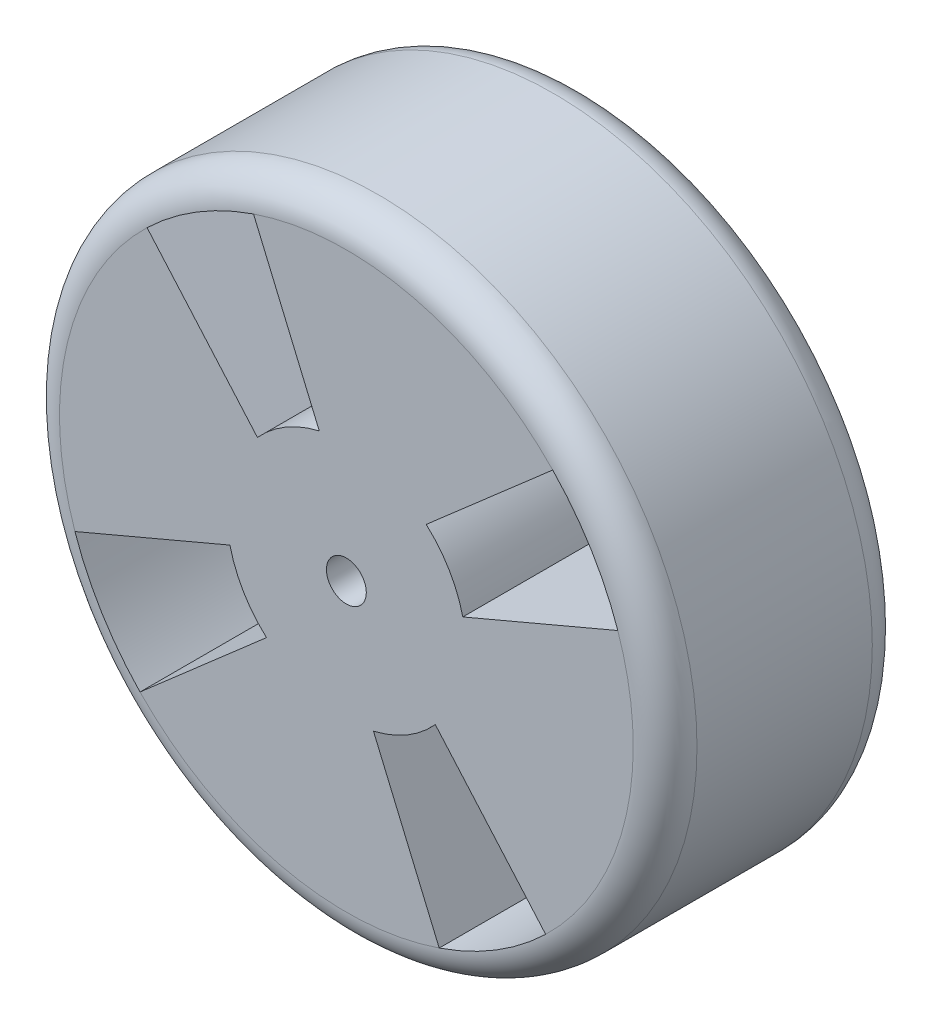
ISO-10303-21;
HEADER;
FILE_DESCRIPTION(('STEP AP214'),'2;1');
FILE_NAME('part.step','',(''),(''),'','','');
FILE_SCHEMA(('AUTOMOTIVE_DESIGN { 1 0 10303 214 1 1 1 1 }'));
ENDSEC;
DATA;
#1=APPLICATION_CONTEXT('core data for automotive mechanical design processes');
#2=APPLICATION_PROTOCOL_DEFINITION('international standard','automotive_design',2000,#1);
#3=PRODUCT_CONTEXT('',#1,'mechanical');
#4=PRODUCT('Part','Part','',(#3));
#5=PRODUCT_RELATED_PRODUCT_CATEGORY('part','',(#4));
#6=PRODUCT_DEFINITION_FORMATION('','',#4);
#7=PRODUCT_DEFINITION_CONTEXT('part definition',#1,'design');
#8=PRODUCT_DEFINITION('design','',#6,#7);
#9=PRODUCT_DEFINITION_SHAPE('','',#8);
#10=(LENGTH_UNIT() NAMED_UNIT(*) SI_UNIT(.MILLI.,.METRE.));
#11=(NAMED_UNIT(*) PLANE_ANGLE_UNIT() SI_UNIT($,.RADIAN.));
#12=(NAMED_UNIT(*) SI_UNIT($,.STERADIAN.) SOLID_ANGLE_UNIT());
#13=UNCERTAINTY_MEASURE_WITH_UNIT(LENGTH_MEASURE(1.E-05),#10,'distance_accuracy_value','');
#14=(GEOMETRIC_REPRESENTATION_CONTEXT(3) GLOBAL_UNCERTAINTY_ASSIGNED_CONTEXT((#13)) GLOBAL_UNIT_ASSIGNED_CONTEXT((#10,
#11,#12)) REPRESENTATION_CONTEXT('',''));
#15=CARTESIAN_POINT('',(0.,0.,0.));
#16=DIRECTION('',(0.,0.,1.));
#17=DIRECTION('',(1.,0.,0.));
#18=AXIS2_PLACEMENT_3D('',#15,#16,#17);
#19=CARTESIAN_POINT('',(0.,0.,-76.2));
#20=DIRECTION('',(0.,0.,1.));
#21=DIRECTION('',(1.,0.,0.));
#22=AXIS2_PLACEMENT_3D('',#19,#20,#21);
#23=PLANE('',#22);
#24=CARTESIAN_POINT('',(0.,0.,-76.2));
#25=DIRECTION('',(0.,0.,1.));
#26=DIRECTION('',(1.,0.,0.));
#27=AXIS2_PLACEMENT_3D('',#24,#25,#26);
#28=CIRCLE('',#27,6.35);
#29=CARTESIAN_POINT('',(6.35,0.,-76.2));
#30=VERTEX_POINT('',#29);
#31=EDGE_CURVE('E219',#30,#30,#28,.F.);
#32=ORIENTED_EDGE('',*,*,#31,.F.);
#33=EDGE_LOOP('',(#32));
#34=FACE_BOUND('',#33,.T.);
#35=DIRECTION('',(-0.390462395273244,0.92061887764562,0.));
#36=VECTOR('',#35,1.);
#37=CARTESIAN_POINT('',(-29.5936715184726,86.5187159293101,-76.2));
#38=LINE('',#37,#36);
#39=CARTESIAN_POINT('',(-8.63712455840803,37.108086441671,-76.2));
#40=VERTEX_POINT('',#39);
#41=CARTESIAN_POINT('',(-29.5936715184726,86.5187159293101,-76.2));
#42=VERTEX_POINT('',#41);
#43=EDGE_CURVE('E272',#40,#42,#38,.T.);
#44=ORIENTED_EDGE('',*,*,#43,.T.);
#45=CARTESIAN_POINT('',(0.,0.,-76.2));
#46=DIRECTION('',(0.,0.,1.));
#47=DIRECTION('',(1.,0.,0.));
#48=AXIS2_PLACEMENT_3D('',#45,#46,#47);
#49=CIRCLE('',#48,91.44);
#50=CARTESIAN_POINT('',(65.773312703652,63.5227906816728,-76.2));
#51=VERTEX_POINT('',#50);
#52=EDGE_CURVE('E202',#42,#51,#49,.F.);
#53=ORIENTED_EDGE('',*,*,#52,.T.);
#54=DIRECTION('',(0.753572898777188,0.657364348157509,0.));
#55=VECTOR('',#54,1.);
#56=CARTESIAN_POINT('',(65.7733127036517,63.5227906816725,-76.2));
#57=LINE('',#56,#55);
#58=CARTESIAN_POINT('',(25.4532274537559,28.3503652919561,-76.2));
#59=VERTEX_POINT('',#58);
#60=EDGE_CURVE('E58',#59,#51,#57,.T.);
#61=ORIENTED_EDGE('',*,*,#60,.F.);
#62=CARTESIAN_POINT('',(9.00235652214454E-13,3.496822267853E-12,-76.2));
#63=DIRECTION('',(0.,0.,1.));
#64=DIRECTION('',(1.,0.,0.));
#65=AXIS2_PLACEMENT_3D('',#62,#63,#64);
#66=CIRCLE('',#65,38.0999999999966);
#67=CARTESIAN_POINT('',(37.1080864416684,8.63712455841242,-76.2));
#68=VERTEX_POINT('',#67);
#69=EDGE_CURVE('E227',#68,#59,#66,.T.);
#70=ORIENTED_EDGE('',*,*,#69,.F.);
#71=DIRECTION('',(0.92061887764562,0.390462395273245,0.));
#72=VECTOR('',#71,1.);
#73=CARTESIAN_POINT('',(86.5187159293075,29.593671518477,-76.2));
#74=LINE('',#73,#72);
#75=CARTESIAN_POINT('',(86.5187159293075,29.593671518477,-76.2));
#76=VERTEX_POINT('',#75);
#77=EDGE_CURVE('E258',#68,#76,#74,.T.);
#78=ORIENTED_EDGE('',*,*,#77,.T.);
#79=CARTESIAN_POINT('',(63.5227906816734,-65.7733127036513,-76.2));
#80=VERTEX_POINT('',#79);
#81=EDGE_CURVE('E207',#76,#80,#49,.F.);
#82=ORIENTED_EDGE('',*,*,#81,.T.);
#83=DIRECTION('',(0.657364348157509,-0.753572898777188,0.));
#84=VECTOR('',#83,1.);
#85=CARTESIAN_POINT('',(63.5227906816699,-65.7733127036473,-76.2));
#86=LINE('',#85,#84);
#87=CARTESIAN_POINT('',(28.3503652919535,-25.4532274537515,-76.2));
#88=VERTEX_POINT('',#87);
#89=EDGE_CURVE('E267',#88,#80,#86,.T.);
#90=ORIENTED_EDGE('',*,*,#89,.F.);
#91=CARTESIAN_POINT('',(9.00235652214454E-13,3.496822267853E-12,-76.2));
#92=DIRECTION('',(0.,0.,1.));
#93=DIRECTION('',(1.,0.,0.));
#94=AXIS2_PLACEMENT_3D('',#91,#92,#93);
#95=CIRCLE('',#94,38.0999999999966);
#96=CARTESIAN_POINT('',(8.63712455840983,-37.108086441664,-76.2));
#97=VERTEX_POINT('',#96);
#98=EDGE_CURVE('E306',#97,#88,#95,.T.);
#99=ORIENTED_EDGE('',*,*,#98,.F.);
#100=DIRECTION('',(0.390462395273245,-0.92061887764562,0.));
#101=VECTOR('',#100,1.);
#102=CARTESIAN_POINT('',(29.5936715184744,-86.5187159293031,-76.2));
#103=LINE('',#102,#101);
#104=CARTESIAN_POINT('',(29.5936715184744,-86.5187159293031,-76.2));
#105=VERTEX_POINT('',#104);
#106=EDGE_CURVE('E310',#97,#105,#103,.T.);
#107=ORIENTED_EDGE('',*,*,#106,.T.);
#108=CARTESIAN_POINT('',(-65.7733127036548,-63.5227906816698,-76.2));
#109=VERTEX_POINT('',#108);
#110=EDGE_CURVE('E201',#105,#109,#49,.F.);
#111=ORIENTED_EDGE('',*,*,#110,.T.);
#112=DIRECTION('',(-0.753572898777188,-0.657364348157509,0.));
#113=VECTOR('',#112,1.);
#114=CARTESIAN_POINT('',(-65.7733127036499,-63.5227906816655,-76.2));
#115=LINE('',#114,#113);
#116=CARTESIAN_POINT('',(-25.4532274537541,-28.3503652919491,-76.2));
#117=VERTEX_POINT('',#116);
#118=EDGE_CURVE('E169',#117,#109,#115,.T.);
#119=ORIENTED_EDGE('',*,*,#118,.F.);
#120=CARTESIAN_POINT('',(9.00235652214454E-13,3.496822267853E-12,-76.2));
#121=DIRECTION('',(0.,0.,1.));
#122=DIRECTION('',(1.,0.,0.));
#123=AXIS2_PLACEMENT_3D('',#120,#121,#122);
#124=CIRCLE('',#123,38.0999999999966);
#125=CARTESIAN_POINT('',(-37.1080864416666,-8.63712455840543,-76.2));
#126=VERTEX_POINT('',#125);
#127=EDGE_CURVE('E182',#126,#117,#124,.T.);
#128=ORIENTED_EDGE('',*,*,#127,.F.);
#129=DIRECTION('',(-0.92061887764562,-0.390462395273245,0.));
#130=VECTOR('',#129,1.);
#131=CARTESIAN_POINT('',(-86.5187159293057,-29.59367151847,-76.2));
#132=LINE('',#131,#130);
#133=CARTESIAN_POINT('',(-86.5187159293057,-29.59367151847,-76.2));
#134=VERTEX_POINT('',#133);
#135=EDGE_CURVE('E160',#126,#134,#132,.T.);
#136=ORIENTED_EDGE('',*,*,#135,.T.);
#137=CARTESIAN_POINT('',(-63.5227906816692,65.7733127036555,-76.2));
#138=VERTEX_POINT('',#137);
#139=EDGE_CURVE('E187',#134,#138,#49,.F.);
#140=ORIENTED_EDGE('',*,*,#139,.T.);
#141=DIRECTION('',(-0.657364348157509,0.753572898777187,0.));
#142=VECTOR('',#141,1.);
#143=CARTESIAN_POINT('',(-63.5227906816681,65.7733127036543,-76.2));
#144=LINE('',#143,#142);
#145=CARTESIAN_POINT('',(-28.3503652919517,25.4532274537585,-76.2));
#146=VERTEX_POINT('',#145);
#147=EDGE_CURVE('E66',#146,#138,#144,.T.);
#148=ORIENTED_EDGE('',*,*,#147,.F.);
#149=CARTESIAN_POINT('',(9.00235652214454E-13,3.496822267853E-12,-76.2));
#150=DIRECTION('',(0.,0.,1.));
#151=DIRECTION('',(1.,0.,0.));
#152=AXIS2_PLACEMENT_3D('',#149,#150,#151);
#153=CIRCLE('',#152,38.0999999999966);
#154=EDGE_CURVE('E268',#40,#146,#153,.T.);
#155=ORIENTED_EDGE('',*,*,#154,.F.);
#156=EDGE_LOOP('',(#44,#53,#61,#70,#78,#82,#90,#99,#107,#111,#119,#128,#136,#140,#148,#155));
#157=FACE_BOUND('',#156,.T.);
#158=ADVANCED_FACE('F41',(#34,#157),#23,.F.);
#159=CARTESIAN_POINT('',(0.,0.,0.));
#160=DIRECTION('',(0.,0.,1.));
#161=DIRECTION('',(1.,0.,0.));
#162=AXIS2_PLACEMENT_3D('',#159,#160,#161);
#163=PLANE('',#162);
#164=CARTESIAN_POINT('',(0.,0.,0.));
#165=DIRECTION('',(0.,0.,1.));
#166=DIRECTION('',(1.,0.,0.));
#167=AXIS2_PLACEMENT_3D('',#164,#165,#166);
#168=CIRCLE('',#167,6.35);
#169=CARTESIAN_POINT('',(6.35,0.,0.));
#170=VERTEX_POINT('',#169);
#171=EDGE_CURVE('E223',#170,#170,#168,.T.);
#172=ORIENTED_EDGE('',*,*,#171,.F.);
#173=EDGE_LOOP('',(#172));
#174=FACE_BOUND('',#173,.T.);
#175=CARTESIAN_POINT('',(0.,0.,0.));
#176=DIRECTION('',(0.,0.,1.));
#177=DIRECTION('',(1.,0.,0.));
#178=AXIS2_PLACEMENT_3D('',#175,#176,#177);
#179=CIRCLE('',#178,91.44);
#180=CARTESIAN_POINT('',(65.7733127036517,63.5227906816725,0.));
#181=VERTEX_POINT('',#180);
#182=CARTESIAN_POINT('',(-29.5936715184727,86.5187159293106,0.));
#183=VERTEX_POINT('',#182);
#184=EDGE_CURVE('E50',#181,#183,#179,.T.);
#185=ORIENTED_EDGE('',*,*,#184,.T.);
#186=DIRECTION('',(0.390462395273244,-0.92061887764562,0.));
#187=VECTOR('',#186,1.);
#188=CARTESIAN_POINT('',(-29.5936715184726,86.5187159293101,0.));
#189=LINE('',#188,#187);
#190=CARTESIAN_POINT('',(-8.63712455840803,37.108086441671,0.));
#191=VERTEX_POINT('',#190);
#192=EDGE_CURVE('E279',#183,#191,#189,.T.);
#193=ORIENTED_EDGE('',*,*,#192,.T.);
#194=CARTESIAN_POINT('',(9.00235652214454E-13,3.496822267853E-12,0.));
#195=DIRECTION('',(0.,0.,-1.));
#196=DIRECTION('',(-1.,0.,0.));
#197=AXIS2_PLACEMENT_3D('',#194,#195,#196);
#198=CIRCLE('',#197,38.0999999999966);
#199=CARTESIAN_POINT('',(-28.3503652919517,25.4532274537585,0.));
#200=VERTEX_POINT('',#199);
#201=EDGE_CURVE('E283',#200,#191,#198,.T.);
#202=ORIENTED_EDGE('',*,*,#201,.F.);
#203=DIRECTION('',(0.657364348157509,-0.753572898777188,0.));
#204=VECTOR('',#203,1.);
#205=CARTESIAN_POINT('',(-63.5227906816681,65.7733127036543,0.));
#206=LINE('',#205,#204);
#207=CARTESIAN_POINT('',(-63.5227906816681,65.7733127036543,0.));
#208=VERTEX_POINT('',#207);
#209=EDGE_CURVE('E287',#208,#200,#206,.T.);
#210=ORIENTED_EDGE('',*,*,#209,.F.);
#211=CARTESIAN_POINT('',(-86.5187159293109,-29.5936715184718,0.));
#212=VERTEX_POINT('',#211);
#213=EDGE_CURVE('E456',#208,#212,#179,.T.);
#214=ORIENTED_EDGE('',*,*,#213,.T.);
#215=DIRECTION('',(0.92061887764562,0.390462395273245,0.));
#216=VECTOR('',#215,1.);
#217=CARTESIAN_POINT('',(-86.5187159293057,-29.59367151847,0.));
#218=LINE('',#217,#216);
#219=CARTESIAN_POINT('',(-37.1080864416666,-8.63712455840543,0.));
#220=VERTEX_POINT('',#219);
#221=EDGE_CURVE('E163',#212,#220,#218,.T.);
#222=ORIENTED_EDGE('',*,*,#221,.T.);
#223=CARTESIAN_POINT('',(9.00235652214454E-13,3.496822267853E-12,0.));
#224=DIRECTION('',(0.,0.,-1.));
#225=DIRECTION('',(-1.,0.,0.));
#226=AXIS2_PLACEMENT_3D('',#223,#224,#225);
#227=CIRCLE('',#226,38.0999999999966);
#228=CARTESIAN_POINT('',(-25.4532274537541,-28.3503652919491,0.));
#229=VERTEX_POINT('',#228);
#230=EDGE_CURVE('E351',#229,#220,#227,.T.);
#231=ORIENTED_EDGE('',*,*,#230,.F.);
#232=DIRECTION('',(0.753572898777188,0.657364348157509,0.));
#233=VECTOR('',#232,1.);
#234=CARTESIAN_POINT('',(-65.7733127036499,-63.5227906816655,0.));
#235=LINE('',#234,#233);
#236=CARTESIAN_POINT('',(-65.7733127036499,-63.5227906816655,0.));
#237=VERTEX_POINT('',#236);
#238=EDGE_CURVE('E355',#237,#229,#235,.T.);
#239=ORIENTED_EDGE('',*,*,#238,.F.);
#240=CARTESIAN_POINT('',(29.5936715184765,-86.5187159293093,0.));
#241=VERTEX_POINT('',#240);
#242=EDGE_CURVE('E453',#237,#241,#179,.T.);
#243=ORIENTED_EDGE('',*,*,#242,.T.);
#244=DIRECTION('',(-0.390462395273245,0.92061887764562,0.));
#245=VECTOR('',#244,1.);
#246=CARTESIAN_POINT('',(29.5936715184744,-86.5187159293031,0.));
#247=LINE('',#246,#245);
#248=CARTESIAN_POINT('',(8.63712455840983,-37.108086441664,0.));
#249=VERTEX_POINT('',#248);
#250=EDGE_CURVE('E318',#241,#249,#247,.T.);
#251=ORIENTED_EDGE('',*,*,#250,.T.);
#252=CARTESIAN_POINT('',(9.00235652214454E-13,3.496822267853E-12,0.));
#253=DIRECTION('',(0.,0.,-1.));
#254=DIRECTION('',(-1.,0.,0.));
#255=AXIS2_PLACEMENT_3D('',#252,#253,#254);
#256=CIRCLE('',#255,38.0999999999966);
#257=CARTESIAN_POINT('',(28.3503652919535,-25.4532274537515,0.));
#258=VERTEX_POINT('',#257);
#259=EDGE_CURVE('E322',#258,#249,#256,.T.);
#260=ORIENTED_EDGE('',*,*,#259,.F.);
#261=DIRECTION('',(-0.657364348157509,0.753572898777188,0.));
#262=VECTOR('',#261,1.);
#263=CARTESIAN_POINT('',(63.5227906816699,-65.7733127036473,0.));
#264=LINE('',#263,#262);
#265=CARTESIAN_POINT('',(63.5227906816699,-65.7733127036473,0.));
#266=VERTEX_POINT('',#265);
#267=EDGE_CURVE('E326',#266,#258,#264,.T.);
#268=ORIENTED_EDGE('',*,*,#267,.F.);
#269=CARTESIAN_POINT('',(86.5187159293089,29.5936715184776,0.));
#270=VERTEX_POINT('',#269);
#271=EDGE_CURVE('E51',#266,#270,#179,.T.);
#272=ORIENTED_EDGE('',*,*,#271,.T.);
#273=DIRECTION('',(-0.92061887764562,-0.390462395273245,0.));
#274=VECTOR('',#273,1.);
#275=CARTESIAN_POINT('',(86.5187159293075,29.593671518477,0.));
#276=LINE('',#275,#274);
#277=CARTESIAN_POINT('',(37.1080864416684,8.63712455841242,0.));
#278=VERTEX_POINT('',#277);
#279=EDGE_CURVE('E236',#270,#278,#276,.T.);
#280=ORIENTED_EDGE('',*,*,#279,.T.);
#281=CARTESIAN_POINT('',(9.00235652214454E-13,3.496822267853E-12,0.));
#282=DIRECTION('',(0.,0.,-1.));
#283=DIRECTION('',(-1.,0.,0.));
#284=AXIS2_PLACEMENT_3D('',#281,#282,#283);
#285=CIRCLE('',#284,38.0999999999966);
#286=CARTESIAN_POINT('',(25.4532274537559,28.3503652919561,0.));
#287=VERTEX_POINT('',#286);
#288=EDGE_CURVE('E248',#287,#278,#285,.T.);
#289=ORIENTED_EDGE('',*,*,#288,.F.);
#290=DIRECTION('',(-0.753572898777188,-0.657364348157509,0.));
#291=VECTOR('',#290,1.);
#292=CARTESIAN_POINT('',(65.7733127036517,63.5227906816725,0.));
#293=LINE('',#292,#291);
#294=EDGE_CURVE('E252',#181,#287,#293,.T.);
#295=ORIENTED_EDGE('',*,*,#294,.F.);
#296=EDGE_LOOP('',(#185,#193,#202,#210,#214,#222,#231,#239,#243,#251,#260,#268,#272,#280,#289,#295));
#297=FACE_BOUND('',#296,.T.);
#298=ADVANCED_FACE('F403',(#174,#297),#163,.T.);
#299=CARTESIAN_POINT('',(0.,0.,-76.2));
#300=DIRECTION('',(0.,0.,1.));
#301=DIRECTION('',(1.,0.,0.));
#302=AXIS2_PLACEMENT_3D('',#299,#300,#301);
#303=CYLINDRICAL_SURFACE('',#302,101.6);
#304=CARTESIAN_POINT('',(0.,0.,-66.04));
#305=DIRECTION('',(0.,0.,1.));
#306=DIRECTION('',(1.,0.,0.));
#307=AXIS2_PLACEMENT_3D('',#304,#305,#306);
#308=CIRCLE('',#307,101.6);
#309=CARTESIAN_POINT('',(101.6,0.,-66.04));
#310=VERTEX_POINT('',#309);
#311=EDGE_CURVE('E211',#310,#310,#308,.T.);
#312=CARTESIAN_POINT('',(0.,0.,-10.16));
#313=DIRECTION('',(0.,0.,1.));
#314=DIRECTION('',(1.,0.,0.));
#315=AXIS2_PLACEMENT_3D('',#312,#313,#314);
#316=CIRCLE('',#315,101.6);
#317=CARTESIAN_POINT('',(101.6,0.,-10.16));
#318=VERTEX_POINT('',#317);
#319=EDGE_CURVE('E215',#318,#318,#316,.F.);
#320=CARTESIAN_POINT('',(101.6,0.,-66.04));
#321=CARTESIAN_POINT('',(101.6,0.,-65.4579166666667));
#322=CARTESIAN_POINT('',(101.6,0.,-64.8758333333333));
#323=CARTESIAN_POINT('',(101.6,0.,-63.7116666666667));
#324=CARTESIAN_POINT('',(101.6,0.,-63.1295833333333));
#325=CARTESIAN_POINT('',(101.6,0.,-61.9654166666667));
#326=CARTESIAN_POINT('',(101.6,0.,-61.3833333333333));
#327=CARTESIAN_POINT('',(101.6,0.,-60.2191666666667));
#328=CARTESIAN_POINT('',(101.6,0.,-59.6370833333333));
#329=CARTESIAN_POINT('',(101.6,0.,-58.4729166666667));
#330=CARTESIAN_POINT('',(101.6,0.,-57.8908333333333));
#331=CARTESIAN_POINT('',(101.6,0.,-56.7266666666667));
#332=CARTESIAN_POINT('',(101.6,0.,-56.1445833333333));
#333=CARTESIAN_POINT('',(101.6,0.,-54.9804166666667));
#334=CARTESIAN_POINT('',(101.6,0.,-54.3983333333333));
#335=CARTESIAN_POINT('',(101.6,0.,-53.2341666666667));
#336=CARTESIAN_POINT('',(101.6,0.,-52.6520833333333));
#337=CARTESIAN_POINT('',(101.6,0.,-51.4879166666667));
#338=CARTESIAN_POINT('',(101.6,0.,-50.9058333333333));
#339=CARTESIAN_POINT('',(101.6,0.,-49.7416666666667));
#340=CARTESIAN_POINT('',(101.6,0.,-49.1595833333333));
#341=CARTESIAN_POINT('',(101.6,0.,-47.9954166666667));
#342=CARTESIAN_POINT('',(101.6,0.,-47.4133333333333));
#343=CARTESIAN_POINT('',(101.6,0.,-46.2491666666667));
#344=CARTESIAN_POINT('',(101.6,0.,-45.6670833333333));
#345=CARTESIAN_POINT('',(101.6,0.,-44.5029166666667));
#346=CARTESIAN_POINT('',(101.6,0.,-43.9208333333333));
#347=CARTESIAN_POINT('',(101.6,0.,-42.7566666666667));
#348=CARTESIAN_POINT('',(101.6,0.,-42.1745833333333));
#349=CARTESIAN_POINT('',(101.6,0.,-41.0104166666667));
#350=CARTESIAN_POINT('',(101.6,0.,-40.4283333333333));
#351=CARTESIAN_POINT('',(101.6,0.,-39.2641666666667));
#352=CARTESIAN_POINT('',(101.6,0.,-38.6820833333333));
#353=CARTESIAN_POINT('',(101.6,0.,-37.5179166666667));
#354=CARTESIAN_POINT('',(101.6,0.,-36.9358333333333));
#355=CARTESIAN_POINT('',(101.6,0.,-35.7716666666667));
#356=CARTESIAN_POINT('',(101.6,0.,-35.1895833333333));
#357=CARTESIAN_POINT('',(101.6,0.,-34.0254166666667));
#358=CARTESIAN_POINT('',(101.6,0.,-33.4433333333333));
#359=CARTESIAN_POINT('',(101.6,0.,-32.2791666666667));
#360=CARTESIAN_POINT('',(101.6,0.,-31.6970833333333));
#361=CARTESIAN_POINT('',(101.6,0.,-30.5329166666667));
#362=CARTESIAN_POINT('',(101.6,0.,-29.9508333333333));
#363=CARTESIAN_POINT('',(101.6,0.,-28.7866666666667));
#364=CARTESIAN_POINT('',(101.6,0.,-28.2045833333333));
#365=CARTESIAN_POINT('',(101.6,0.,-27.0404166666667));
#366=CARTESIAN_POINT('',(101.6,0.,-26.4583333333333));
#367=CARTESIAN_POINT('',(101.6,0.,-25.2941666666667));
#368=CARTESIAN_POINT('',(101.6,0.,-24.7120833333333));
#369=CARTESIAN_POINT('',(101.6,0.,-23.5479166666667));
#370=CARTESIAN_POINT('',(101.6,0.,-22.9658333333333));
#371=CARTESIAN_POINT('',(101.6,0.,-21.8016666666667));
#372=CARTESIAN_POINT('',(101.6,0.,-21.2195833333333));
#373=CARTESIAN_POINT('',(101.6,0.,-20.0554166666667));
#374=CARTESIAN_POINT('',(101.6,0.,-19.4733333333333));
#375=CARTESIAN_POINT('',(101.6,0.,-18.3091666666667));
#376=CARTESIAN_POINT('',(101.6,0.,-17.7270833333333));
#377=CARTESIAN_POINT('',(101.6,0.,-16.5629166666667));
#378=CARTESIAN_POINT('',(101.6,0.,-15.9808333333333));
#379=CARTESIAN_POINT('',(101.6,0.,-14.8166666666667));
#380=CARTESIAN_POINT('',(101.6,0.,-14.2345833333333));
#381=CARTESIAN_POINT('',(101.6,0.,-13.0704166666667));
#382=CARTESIAN_POINT('',(101.6,0.,-12.4883333333333));
#383=CARTESIAN_POINT('',(101.6,0.,-11.3241666666667));
#384=CARTESIAN_POINT('',(101.6,0.,-10.7420833333333));
#385=CARTESIAN_POINT('',(101.6,0.,-10.16));
#386=B_SPLINE_CURVE_WITH_KNOTS('',3,(#320,#321,#322,#323,#324,#325,#326,#327,#328,#329,#330,
#331,#332,#333,#334,#335,#336,#337,#338,#339,#340,#341,#342,#343,#344,#345,#346,#347,#348,#349,
#350,#351,#352,#353,#354,#355,#356,#357,#358,#359,#360,#361,#362,#363,#364,#365,#366,#367,#368,
#369,#370,#371,#372,#373,#374,#375,#376,#377,#378,#379,#380,#381,#382,#383,#384,#385),
.UNSPECIFIED.,.F.,.F.,(4,2,2,2,2,2,2,2,2,2,2,2,2,2,2,2,2,2,2,2,2,2,2,2,2,2,2,2,2,2,2,2,4),(0.,
1.74624999999999,3.4925,5.23874999999999,6.98499999999999,8.73125,10.4775,12.22375,13.97,
15.71625,17.4625,19.20875,20.955,22.70125,24.4475,26.19375,27.94,29.68625,31.4325,33.17875,
34.925,36.67125,38.4175,40.16375,41.91,43.65625,45.4025,47.14875,48.895,50.64125,52.3875,
54.13375,55.88),.UNSPECIFIED.);
#387=EDGE_CURVE('BSEAM421',#310,#318,#386,.T.);
#388=ORIENTED_EDGE('',*,*,#311,.T.);
#389=ORIENTED_EDGE('',*,*,#319,.T.);
#390=ORIENTED_EDGE('',*,*,#387,.T.);
#391=ORIENTED_EDGE('',*,*,#387,.F.);
#392=EDGE_LOOP('',(#388,#390,#389,#391));
#393=FACE_BOUND('',#392,.T.);
#394=ADVANCED_FACE('F421',(#393),#303,.T.);
#395=CARTESIAN_POINT('',(0.,0.,-66.04));
#396=DIRECTION('',(0.,0.,1.));
#397=DIRECTION('',(1.,0.,0.));
#398=AXIS2_PLACEMENT_3D('',#395,#396,#397);
#399=TOROIDAL_SURFACE('',#398,91.44,10.16);
#400=EDGE_CURVE('E205',#80,#105,#49,.F.);
#401=ORIENTED_EDGE('',*,*,#400,.F.);
#402=ORIENTED_EDGE('',*,*,#81,.F.);
#403=CARTESIAN_POINT('',(0.,0.,-76.2));
#404=DIRECTION('',(0.,0.,1.));
#405=DIRECTION('',(1.,0.,0.));
#406=AXIS2_PLACEMENT_3D('',#403,#404,#405);
#407=CIRCLE('',#406,91.44);
#408=EDGE_CURVE('E181',#51,#76,#407,.F.);
#409=ORIENTED_EDGE('',*,*,#408,.F.);
#410=ORIENTED_EDGE('',*,*,#52,.F.);
#411=CARTESIAN_POINT('',(0.,0.,-76.2));
#412=DIRECTION('',(0.,0.,1.));
#413=DIRECTION('',(1.,0.,0.));
#414=AXIS2_PLACEMENT_3D('',#411,#412,#413);
#415=CIRCLE('',#414,91.44);
#416=EDGE_CURVE('E199',#138,#42,#415,.F.);
#417=ORIENTED_EDGE('',*,*,#416,.F.);
#418=ORIENTED_EDGE('',*,*,#139,.F.);
#419=CARTESIAN_POINT('',(0.,0.,-76.2));
#420=DIRECTION('',(0.,0.,1.));
#421=DIRECTION('',(1.,0.,0.));
#422=AXIS2_PLACEMENT_3D('',#419,#420,#421);
#423=CIRCLE('',#422,91.44);
#424=EDGE_CURVE('E173',#109,#134,#423,.F.);
#425=ORIENTED_EDGE('',*,*,#424,.F.);
#426=ORIENTED_EDGE('',*,*,#110,.F.);
#427=EDGE_LOOP('',(#401,#402,#409,#410,#417,#418,#425,#426));
#428=FACE_BOUND('',#427,.T.);
#429=ORIENTED_EDGE('',*,*,#311,.F.);
#430=EDGE_LOOP('',(#429));
#431=FACE_BOUND('',#430,.T.);
#432=ADVANCED_FACE('F195',(#428,#431),#399,.T.);
#433=CARTESIAN_POINT('',(0.,0.,-10.16));
#434=DIRECTION('',(0.,0.,1.));
#435=DIRECTION('',(1.,0.,0.));
#436=AXIS2_PLACEMENT_3D('',#433,#434,#435);
#437=TOROIDAL_SURFACE('',#436,91.44,10.16);
#438=ORIENTED_EDGE('',*,*,#319,.F.);
#439=EDGE_LOOP('',(#438));
#440=FACE_BOUND('',#439,.T.);
#441=EDGE_CURVE('E11',#270,#181,#179,.T.);
#442=ORIENTED_EDGE('',*,*,#441,.F.);
#443=ORIENTED_EDGE('',*,*,#271,.F.);
#444=CARTESIAN_POINT('',(9.00235652214454E-13,3.49682226785299E-12,0.));
#445=DIRECTION('',(0.,0.,-1.));
#446=DIRECTION('',(-1.,0.,0.));
#447=AXIS2_PLACEMENT_3D('',#444,#445,#446);
#448=CIRCLE('',#447,91.4399999999965);
#449=EDGE_CURVE('E314',#266,#241,#448,.T.);
#450=ORIENTED_EDGE('',*,*,#449,.T.);
#451=ORIENTED_EDGE('',*,*,#242,.F.);
#452=CARTESIAN_POINT('',(9.00235652214454E-13,3.49682226785299E-12,0.));
#453=DIRECTION('',(0.,0.,-1.));
#454=DIRECTION('',(-1.,0.,0.));
#455=AXIS2_PLACEMENT_3D('',#452,#453,#454);
#456=CIRCLE('',#455,91.4399999999965);
#457=EDGE_CURVE('E191',#237,#212,#456,.T.);
#458=ORIENTED_EDGE('',*,*,#457,.T.);
#459=ORIENTED_EDGE('',*,*,#213,.F.);
#460=CARTESIAN_POINT('',(9.00235652214454E-13,3.49682226785299E-12,0.));
#461=DIRECTION('',(0.,0.,-1.));
#462=DIRECTION('',(-1.,0.,0.));
#463=AXIS2_PLACEMENT_3D('',#460,#461,#462);
#464=CIRCLE('',#463,91.4399999999965);
#465=EDGE_CURVE('E275',#208,#183,#464,.T.);
#466=ORIENTED_EDGE('',*,*,#465,.T.);
#467=ORIENTED_EDGE('',*,*,#184,.F.);
#468=EDGE_LOOP('',(#442,#443,#450,#451,#458,#459,#466,#467));
#469=FACE_BOUND('',#468,.T.);
#470=ADVANCED_FACE('F43',(#440,#469),#437,.T.);
#471=CARTESIAN_POINT('',(0.,0.,-76.201));
#472=DIRECTION('',(0.,0.,1.));
#473=DIRECTION('',(1.,0.,0.));
#474=AXIS2_PLACEMENT_3D('',#471,#472,#473);
#475=CYLINDRICAL_SURFACE('',#474,6.35);
#476=ORIENTED_EDGE('',*,*,#171,.T.);
#477=EDGE_LOOP('',(#476));
#478=FACE_BOUND('',#477,.T.);
#479=ORIENTED_EDGE('',*,*,#31,.T.);
#480=EDGE_LOOP('',(#479));
#481=FACE_BOUND('',#480,.T.);
#482=ADVANCED_FACE('F426',(#478,#481),#475,.F.);
#483=CARTESIAN_POINT('',(65.7733127036517,63.5227906816725,-76.201));
#484=DIRECTION('',(-0.657364348157509,0.753572898777188,0.));
#485=DIRECTION('',(-0.753572898777188,-0.657364348157509,0.));
#486=AXIS2_PLACEMENT_3D('',#483,#484,#485);
#487=PLANE('',#486);
#488=ORIENTED_EDGE('',*,*,#60,.T.);
#489=DIRECTION('',(0.,0.,1.));
#490=VECTOR('',#489,1.);
#491=CARTESIAN_POINT('',(65.7733127036517,63.5227906816725,-76.201));
#492=LINE('',#491,#490);
#493=EDGE_CURVE('E231',#51,#181,#492,.T.);
#494=ORIENTED_EDGE('',*,*,#493,.T.);
#495=ORIENTED_EDGE('',*,*,#294,.T.);
#496=DIRECTION('',(0.,0.,1.));
#497=VECTOR('',#496,1.);
#498=CARTESIAN_POINT('',(25.4532274537559,28.3503652919561,-76.201));
#499=LINE('',#498,#497);
#500=EDGE_CURVE('E232',#59,#287,#499,.T.);
#501=ORIENTED_EDGE('',*,*,#500,.F.);
#502=EDGE_LOOP('',(#488,#494,#495,#501));
#503=FACE_BOUND('',#502,.T.);
#504=ADVANCED_FACE('F440',(#503),#487,.F.);
#505=CARTESIAN_POINT('',(86.5187159293075,29.593671518477,-76.201));
#506=DIRECTION('',(-0.390462395273245,0.92061887764562,0.));
#507=DIRECTION('',(-0.92061887764562,-0.390462395273245,0.));
#508=AXIS2_PLACEMENT_3D('',#505,#506,#507);
#509=PLANE('',#508);
#510=DIRECTION('',(0.,0.,1.));
#511=VECTOR('',#510,1.);
#512=CARTESIAN_POINT('',(37.1080864416684,8.63712455841242,-76.201));
#513=LINE('',#512,#511);
#514=EDGE_CURVE('E235',#68,#278,#513,.T.);
#515=ORIENTED_EDGE('',*,*,#514,.T.);
#516=ORIENTED_EDGE('',*,*,#279,.F.);
#517=DIRECTION('',(0.,0.,1.));
#518=VECTOR('',#517,1.);
#519=CARTESIAN_POINT('',(86.5187159293075,29.593671518477,-76.201));
#520=LINE('',#519,#518);
#521=EDGE_CURVE('E239',#76,#270,#520,.T.);
#522=ORIENTED_EDGE('',*,*,#521,.F.);
#523=ORIENTED_EDGE('',*,*,#77,.F.);
#524=EDGE_LOOP('',(#515,#516,#522,#523));
#525=FACE_BOUND('',#524,.T.);
#526=ADVANCED_FACE('F385',(#525),#509,.T.);
#527=CARTESIAN_POINT('',(9.00235652214454E-13,3.496822267853E-12,-76.201));
#528=DIRECTION('',(0.,0.,1.));
#529=DIRECTION('',(1.,0.,0.));
#530=AXIS2_PLACEMENT_3D('',#527,#528,#529);
#531=CYLINDRICAL_SURFACE('',#530,38.0999999999966);
#532=ORIENTED_EDGE('',*,*,#69,.T.);
#533=ORIENTED_EDGE('',*,*,#500,.T.);
#534=ORIENTED_EDGE('',*,*,#288,.T.);
#535=ORIENTED_EDGE('',*,*,#514,.F.);
#536=EDGE_LOOP('',(#532,#533,#534,#535));
#537=FACE_BOUND('',#536,.T.);
#538=ADVANCED_FACE('F450',(#537),#531,.T.);
#539=CARTESIAN_POINT('',(9.00235652214454E-13,3.49682226785299E-12,-76.201));
#540=DIRECTION('',(0.,0.,1.));
#541=DIRECTION('',(1.,0.,0.));
#542=AXIS2_PLACEMENT_3D('',#539,#540,#541);
#543=CYLINDRICAL_SURFACE('',#542,91.4399999999965);
#544=ORIENTED_EDGE('',*,*,#408,.T.);
#545=ORIENTED_EDGE('',*,*,#521,.T.);
#546=ORIENTED_EDGE('',*,*,#441,.T.);
#547=ORIENTED_EDGE('',*,*,#493,.F.);
#548=EDGE_LOOP('',(#544,#545,#546,#547));
#549=FACE_BOUND('',#548,.T.);
#550=ADVANCED_FACE('F388',(#549),#543,.F.);
#551=CARTESIAN_POINT('',(-86.5187159293057,-29.59367151847,-76.201));
#552=DIRECTION('',(0.390462395273245,-0.920618877645619,0.));
#553=DIRECTION('',(0.92061887764562,0.390462395273245,0.));
#554=AXIS2_PLACEMENT_3D('',#551,#552,#553);
#555=PLANE('',#554);
#556=DIRECTION('',(0.,0.,1.));
#557=VECTOR('',#556,1.);
#558=CARTESIAN_POINT('',(-37.1080864416666,-8.63712455840543,-76.201));
#559=LINE('',#558,#557);
#560=EDGE_CURVE('E168',#126,#220,#559,.T.);
#561=ORIENTED_EDGE('',*,*,#560,.T.);
#562=ORIENTED_EDGE('',*,*,#221,.F.);
#563=DIRECTION('',(0.,0.,1.));
#564=VECTOR('',#563,1.);
#565=CARTESIAN_POINT('',(-86.5187159293057,-29.59367151847,-76.201));
#566=LINE('',#565,#564);
#567=EDGE_CURVE('E156',#134,#212,#566,.T.);
#568=ORIENTED_EDGE('',*,*,#567,.F.);
#569=ORIENTED_EDGE('',*,*,#135,.F.);
#570=EDGE_LOOP('',(#561,#562,#568,#569));
#571=FACE_BOUND('',#570,.T.);
#572=ADVANCED_FACE('F158',(#571),#555,.T.);
#573=CARTESIAN_POINT('',(9.00235652214454E-13,3.496822267853E-12,-76.201));
#574=DIRECTION('',(0.,0.,1.));
#575=DIRECTION('',(1.,0.,0.));
#576=AXIS2_PLACEMENT_3D('',#573,#574,#575);
#577=CYLINDRICAL_SURFACE('',#576,38.0999999999966);
#578=ORIENTED_EDGE('',*,*,#127,.T.);
#579=DIRECTION('',(0.,0.,1.));
#580=VECTOR('',#579,1.);
#581=CARTESIAN_POINT('',(-25.4532274537541,-28.3503652919491,-76.201));
#582=LINE('',#581,#580);
#583=EDGE_CURVE('E361',#117,#229,#582,.T.);
#584=ORIENTED_EDGE('',*,*,#583,.T.);
#585=ORIENTED_EDGE('',*,*,#230,.T.);
#586=ORIENTED_EDGE('',*,*,#560,.F.);
#587=EDGE_LOOP('',(#578,#584,#585,#586));
#588=FACE_BOUND('',#587,.T.);
#589=ADVANCED_FACE('F463',(#588),#577,.T.);
#590=CARTESIAN_POINT('',(-65.7733127036499,-63.5227906816655,-76.201));
#591=DIRECTION('',(0.657364348157509,-0.753572898777188,0.));
#592=DIRECTION('',(0.753572898777188,0.657364348157509,0.));
#593=AXIS2_PLACEMENT_3D('',#590,#591,#592);
#594=PLANE('',#593);
#595=ORIENTED_EDGE('',*,*,#118,.T.);
#596=DIRECTION('',(0.,0.,1.));
#597=VECTOR('',#596,1.);
#598=CARTESIAN_POINT('',(-65.7733127036499,-63.5227906816655,-76.201));
#599=LINE('',#598,#597);
#600=EDGE_CURVE('E175',#109,#237,#599,.T.);
#601=ORIENTED_EDGE('',*,*,#600,.T.);
#602=ORIENTED_EDGE('',*,*,#238,.T.);
#603=ORIENTED_EDGE('',*,*,#583,.F.);
#604=EDGE_LOOP('',(#595,#601,#602,#603));
#605=FACE_BOUND('',#604,.T.);
#606=ADVANCED_FACE('F368',(#605),#594,.F.);
#607=CARTESIAN_POINT('',(9.00235652214454E-13,3.49682226785299E-12,-76.201));
#608=DIRECTION('',(0.,0.,1.));
#609=DIRECTION('',(1.,0.,0.));
#610=AXIS2_PLACEMENT_3D('',#607,#608,#609);
#611=CYLINDRICAL_SURFACE('',#610,91.4399999999965);
#612=ORIENTED_EDGE('',*,*,#424,.T.);
#613=ORIENTED_EDGE('',*,*,#567,.T.);
#614=ORIENTED_EDGE('',*,*,#457,.F.);
#615=ORIENTED_EDGE('',*,*,#600,.F.);
#616=EDGE_LOOP('',(#612,#613,#614,#615));
#617=FACE_BOUND('',#616,.T.);
#618=ADVANCED_FACE('F174',(#617),#611,.F.);
#619=CARTESIAN_POINT('',(29.5936715184744,-86.5187159293031,-76.201));
#620=DIRECTION('',(0.92061887764562,0.390462395273245,0.));
#621=DIRECTION('',(-0.390462395273245,0.92061887764562,0.));
#622=AXIS2_PLACEMENT_3D('',#619,#620,#621);
#623=PLANE('',#622);
#624=DIRECTION('',(0.,0.,1.));
#625=VECTOR('',#624,1.);
#626=CARTESIAN_POINT('',(8.63712455840983,-37.108086441664,-76.201));
#627=LINE('',#626,#625);
#628=EDGE_CURVE('E336',#97,#249,#627,.T.);
#629=ORIENTED_EDGE('',*,*,#628,.T.);
#630=ORIENTED_EDGE('',*,*,#250,.F.);
#631=DIRECTION('',(0.,0.,1.));
#632=VECTOR('',#631,1.);
#633=CARTESIAN_POINT('',(29.5936715184744,-86.5187159293031,-76.201));
#634=LINE('',#633,#632);
#635=EDGE_CURVE('E339',#105,#241,#634,.T.);
#636=ORIENTED_EDGE('',*,*,#635,.F.);
#637=ORIENTED_EDGE('',*,*,#106,.F.);
#638=EDGE_LOOP('',(#629,#630,#636,#637));
#639=FACE_BOUND('',#638,.T.);
#640=ADVANCED_FACE('F477',(#639),#623,.T.);
#641=CARTESIAN_POINT('',(9.00235652214454E-13,3.496822267853E-12,-76.201));
#642=DIRECTION('',(0.,0.,1.));
#643=DIRECTION('',(1.,0.,0.));
#644=AXIS2_PLACEMENT_3D('',#641,#642,#643);
#645=CYLINDRICAL_SURFACE('',#644,38.0999999999966);
#646=ORIENTED_EDGE('',*,*,#98,.T.);
#647=DIRECTION('',(0.,0.,1.));
#648=VECTOR('',#647,1.);
#649=CARTESIAN_POINT('',(28.3503652919535,-25.4532274537515,-76.201));
#650=LINE('',#649,#648);
#651=EDGE_CURVE('E333',#88,#258,#650,.T.);
#652=ORIENTED_EDGE('',*,*,#651,.T.);
#653=ORIENTED_EDGE('',*,*,#259,.T.);
#654=ORIENTED_EDGE('',*,*,#628,.F.);
#655=EDGE_LOOP('',(#646,#652,#653,#654));
#656=FACE_BOUND('',#655,.T.);
#657=ADVANCED_FACE('F480',(#656),#645,.T.);
#658=CARTESIAN_POINT('',(63.5227906816699,-65.7733127036473,-76.201));
#659=DIRECTION('',(0.753572898777188,0.657364348157509,0.));
#660=DIRECTION('',(-0.657364348157509,0.753572898777188,0.));
#661=AXIS2_PLACEMENT_3D('',#658,#659,#660);
#662=PLANE('',#661);
#663=ORIENTED_EDGE('',*,*,#89,.T.);
#664=DIRECTION('',(0.,0.,1.));
#665=VECTOR('',#664,1.);
#666=CARTESIAN_POINT('',(63.5227906816699,-65.7733127036473,-76.201));
#667=LINE('',#666,#665);
#668=EDGE_CURVE('E330',#80,#266,#667,.T.);
#669=ORIENTED_EDGE('',*,*,#668,.T.);
#670=ORIENTED_EDGE('',*,*,#267,.T.);
#671=ORIENTED_EDGE('',*,*,#651,.F.);
#672=EDGE_LOOP('',(#663,#669,#670,#671));
#673=FACE_BOUND('',#672,.T.);
#674=ADVANCED_FACE('F476',(#673),#662,.F.);
#675=CARTESIAN_POINT('',(9.00235652214454E-13,3.49682226785299E-12,-76.201));
#676=DIRECTION('',(0.,0.,1.));
#677=DIRECTION('',(1.,0.,0.));
#678=AXIS2_PLACEMENT_3D('',#675,#676,#677);
#679=CYLINDRICAL_SURFACE('',#678,91.4399999999965);
#680=ORIENTED_EDGE('',*,*,#400,.T.);
#681=ORIENTED_EDGE('',*,*,#635,.T.);
#682=ORIENTED_EDGE('',*,*,#449,.F.);
#683=ORIENTED_EDGE('',*,*,#668,.F.);
#684=EDGE_LOOP('',(#680,#681,#682,#683));
#685=FACE_BOUND('',#684,.T.);
#686=ADVANCED_FACE('F376',(#685),#679,.F.);
#687=CARTESIAN_POINT('',(-29.5936715184726,86.5187159293101,-76.201));
#688=DIRECTION('',(-0.92061887764562,-0.390462395273244,0.));
#689=DIRECTION('',(0.390462395273244,-0.92061887764562,0.));
#690=AXIS2_PLACEMENT_3D('',#687,#688,#689);
#691=PLANE('',#690);
#692=DIRECTION('',(0.,0.,1.));
#693=VECTOR('',#692,1.);
#694=CARTESIAN_POINT('',(-8.63712455840803,37.108086441671,-76.201));
#695=LINE('',#694,#693);
#696=EDGE_CURVE('E297',#40,#191,#695,.T.);
#697=ORIENTED_EDGE('',*,*,#696,.T.);
#698=ORIENTED_EDGE('',*,*,#192,.F.);
#699=DIRECTION('',(0.,0.,1.));
#700=VECTOR('',#699,1.);
#701=CARTESIAN_POINT('',(-29.5936715184726,86.5187159293101,-76.201));
#702=LINE('',#701,#700);
#703=EDGE_CURVE('E300',#42,#183,#702,.T.);
#704=ORIENTED_EDGE('',*,*,#703,.F.);
#705=ORIENTED_EDGE('',*,*,#43,.F.);
#706=EDGE_LOOP('',(#697,#698,#704,#705));
#707=FACE_BOUND('',#706,.T.);
#708=ADVANCED_FACE('F392',(#707),#691,.T.);
#709=CARTESIAN_POINT('',(9.00235652214454E-13,3.496822267853E-12,-76.201));
#710=DIRECTION('',(0.,0.,1.));
#711=DIRECTION('',(1.,0.,0.));
#712=AXIS2_PLACEMENT_3D('',#709,#710,#711);
#713=CYLINDRICAL_SURFACE('',#712,38.0999999999966);
#714=ORIENTED_EDGE('',*,*,#154,.T.);
#715=DIRECTION('',(0.,0.,1.));
#716=VECTOR('',#715,1.);
#717=CARTESIAN_POINT('',(-28.3503652919517,25.4532274537585,-76.201));
#718=LINE('',#717,#716);
#719=EDGE_CURVE('E294',#146,#200,#718,.T.);
#720=ORIENTED_EDGE('',*,*,#719,.T.);
#721=ORIENTED_EDGE('',*,*,#201,.T.);
#722=ORIENTED_EDGE('',*,*,#696,.F.);
#723=EDGE_LOOP('',(#714,#720,#721,#722));
#724=FACE_BOUND('',#723,.T.);
#725=ADVANCED_FACE('F405',(#724),#713,.T.);
#726=CARTESIAN_POINT('',(-63.5227906816681,65.7733127036543,-76.201));
#727=DIRECTION('',(-0.753572898777187,-0.657364348157509,0.));
#728=DIRECTION('',(0.657364348157509,-0.753572898777187,0.));
#729=AXIS2_PLACEMENT_3D('',#726,#727,#728);
#730=PLANE('',#729);
#731=ORIENTED_EDGE('',*,*,#147,.T.);
#732=DIRECTION('',(0.,0.,1.));
#733=VECTOR('',#732,1.);
#734=CARTESIAN_POINT('',(-63.5227906816681,65.7733127036543,-76.201));
#735=LINE('',#734,#733);
#736=EDGE_CURVE('E291',#138,#208,#735,.T.);
#737=ORIENTED_EDGE('',*,*,#736,.T.);
#738=ORIENTED_EDGE('',*,*,#209,.T.);
#739=ORIENTED_EDGE('',*,*,#719,.F.);
#740=EDGE_LOOP('',(#731,#737,#738,#739));
#741=FACE_BOUND('',#740,.T.);
#742=ADVANCED_FACE('F397',(#741),#730,.F.);
#743=CARTESIAN_POINT('',(9.00235652214454E-13,3.49682226785299E-12,-76.201));
#744=DIRECTION('',(0.,0.,1.));
#745=DIRECTION('',(1.,0.,0.));
#746=AXIS2_PLACEMENT_3D('',#743,#744,#745);
#747=CYLINDRICAL_SURFACE('',#746,91.4399999999965);
#748=ORIENTED_EDGE('',*,*,#416,.T.);
#749=ORIENTED_EDGE('',*,*,#703,.T.);
#750=ORIENTED_EDGE('',*,*,#465,.F.);
#751=ORIENTED_EDGE('',*,*,#736,.F.);
#752=EDGE_LOOP('',(#748,#749,#750,#751));
#753=FACE_BOUND('',#752,.T.);
#754=ADVANCED_FACE('F395',(#753),#747,.F.);
#755=CLOSED_SHELL('',(#158,#298,#394,#432,#470,#482,#504,#526,#538,#550,#572,#589,#606,#618,
#640,#657,#674,#686,#708,#725,#742,#754));
#756=MANIFOLD_SOLID_BREP('B2',#755);
#757=ADVANCED_BREP_SHAPE_REPRESENTATION('',(#18,#756),#14);
#758=SHAPE_DEFINITION_REPRESENTATION(#9,#757);
ENDSEC;
END-ISO-10303-21;
